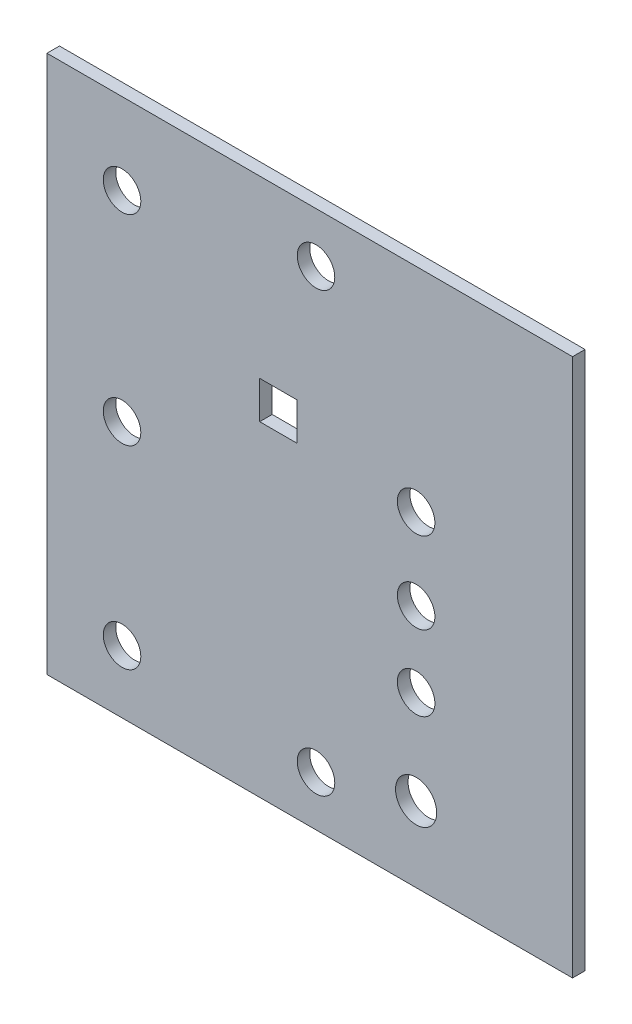
ISO-10303-21;
HEADER;
FILE_DESCRIPTION(('STEP AP214'),'2;1');
FILE_NAME('part.step','',(''),(''),'','','');
FILE_SCHEMA(('AUTOMOTIVE_DESIGN { 1 0 10303 214 1 1 1 1 }'));
ENDSEC;
DATA;
#1=APPLICATION_CONTEXT('core data for automotive mechanical design processes');
#2=APPLICATION_PROTOCOL_DEFINITION('international standard','automotive_design',2000,#1);
#3=PRODUCT_CONTEXT('',#1,'mechanical');
#4=PRODUCT('Part','Part','',(#3));
#5=PRODUCT_RELATED_PRODUCT_CATEGORY('part','',(#4));
#6=PRODUCT_DEFINITION_FORMATION('','',#4);
#7=PRODUCT_DEFINITION_CONTEXT('part definition',#1,'design');
#8=PRODUCT_DEFINITION('design','',#6,#7);
#9=PRODUCT_DEFINITION_SHAPE('','',#8);
#10=(LENGTH_UNIT() NAMED_UNIT(*) SI_UNIT(.MILLI.,.METRE.));
#11=(NAMED_UNIT(*) PLANE_ANGLE_UNIT() SI_UNIT($,.RADIAN.));
#12=(NAMED_UNIT(*) SI_UNIT($,.STERADIAN.) SOLID_ANGLE_UNIT());
#13=UNCERTAINTY_MEASURE_WITH_UNIT(LENGTH_MEASURE(1.E-05),#10,'distance_accuracy_value','');
#14=(GEOMETRIC_REPRESENTATION_CONTEXT(3) GLOBAL_UNCERTAINTY_ASSIGNED_CONTEXT((#13)) GLOBAL_UNIT_ASSIGNED_CONTEXT((#10,
#11,#12)) REPRESENTATION_CONTEXT('',''));
#15=CARTESIAN_POINT('',(0.,0.,0.));
#16=DIRECTION('',(0.,0.,1.));
#17=DIRECTION('',(1.,0.,0.));
#18=AXIS2_PLACEMENT_3D('',#15,#16,#17);
#19=CARTESIAN_POINT('',(0.,-86.,2.));
#20=DIRECTION('',(0.,1.,0.));
#21=DIRECTION('',(0.,0.,1.));
#22=AXIS2_PLACEMENT_3D('',#19,#20,#21);
#23=PLANE('',#22);
#24=DIRECTION('',(1.,0.,0.));
#25=VECTOR('',#24,1.);
#26=CARTESIAN_POINT('',(0.,-86.,0.));
#27=LINE('',#26,#25);
#28=CARTESIAN_POINT('',(1.00000000000001,-86.,0.));
#29=VERTEX_POINT('',#28);
#30=CARTESIAN_POINT('',(85.,-86.,0.));
#31=VERTEX_POINT('',#30);
#32=EDGE_CURVE('E139',#29,#31,#27,.T.);
#33=ORIENTED_EDGE('',*,*,#32,.T.);
#34=DIRECTION('',(0.,0.,1.));
#35=VECTOR('',#34,1.);
#36=CARTESIAN_POINT('',(85.,-86.,-1.));
#37=LINE('',#36,#35);
#38=CARTESIAN_POINT('',(85.,-86.,2.));
#39=VERTEX_POINT('',#38);
#40=EDGE_CURVE('E57',#31,#39,#37,.T.);
#41=ORIENTED_EDGE('',*,*,#40,.T.);
#42=DIRECTION('',(1.,0.,0.));
#43=VECTOR('',#42,1.);
#44=CARTESIAN_POINT('',(0.,-86.,2.));
#45=LINE('',#44,#43);
#46=CARTESIAN_POINT('',(1.00000000000001,-86.,2.));
#47=VERTEX_POINT('',#46);
#48=EDGE_CURVE('E122',#47,#39,#45,.T.);
#49=ORIENTED_EDGE('',*,*,#48,.F.);
#50=DIRECTION('',(0.,0.,1.));
#51=VECTOR('',#50,1.);
#52=CARTESIAN_POINT('',(1.00000000000001,-86.,-1.));
#53=LINE('',#52,#51);
#54=EDGE_CURVE('E206',#29,#47,#53,.T.);
#55=ORIENTED_EDGE('',*,*,#54,.F.);
#56=EDGE_LOOP('',(#33,#41,#49,#55));
#57=FACE_BOUND('',#56,.T.);
#58=ADVANCED_FACE('F42',(#57),#23,.F.);
#59=CARTESIAN_POINT('',(0.,0.,2.));
#60=DIRECTION('',(0.,1.,0.));
#61=DIRECTION('',(0.,0.,1.));
#62=AXIS2_PLACEMENT_3D('',#59,#60,#61);
#63=PLANE('',#62);
#64=DIRECTION('',(0.,0.,1.));
#65=VECTOR('',#64,1.);
#66=CARTESIAN_POINT('',(85.,0.,-1.));
#67=LINE('',#66,#65);
#68=CARTESIAN_POINT('',(85.,0.,0.));
#69=VERTEX_POINT('',#68);
#70=CARTESIAN_POINT('',(85.,0.,2.));
#71=VERTEX_POINT('',#70);
#72=EDGE_CURVE('E104',#69,#71,#67,.T.);
#73=ORIENTED_EDGE('',*,*,#72,.F.);
#74=DIRECTION('',(1.,0.,0.));
#75=VECTOR('',#74,1.);
#76=CARTESIAN_POINT('',(0.,0.,0.));
#77=LINE('',#76,#75);
#78=CARTESIAN_POINT('',(1.00000000000001,0.,0.));
#79=VERTEX_POINT('',#78);
#80=EDGE_CURVE('E135',#79,#69,#77,.T.);
#81=ORIENTED_EDGE('',*,*,#80,.F.);
#82=DIRECTION('',(0.,0.,1.));
#83=VECTOR('',#82,1.);
#84=CARTESIAN_POINT('',(1.,0.,-1.));
#85=LINE('',#84,#83);
#86=CARTESIAN_POINT('',(1.,0.,2.));
#87=VERTEX_POINT('',#86);
#88=EDGE_CURVE('E64',#79,#87,#85,.T.);
#89=ORIENTED_EDGE('',*,*,#88,.T.);
#90=DIRECTION('',(1.,0.,0.));
#91=VECTOR('',#90,1.);
#92=CARTESIAN_POINT('',(0.,0.,2.));
#93=LINE('',#92,#91);
#94=EDGE_CURVE('E120',#87,#71,#93,.T.);
#95=ORIENTED_EDGE('',*,*,#94,.T.);
#96=EDGE_LOOP('',(#73,#81,#89,#95));
#97=FACE_BOUND('',#96,.T.);
#98=ADVANCED_FACE('F126',(#97),#63,.T.);
#99=CARTESIAN_POINT('',(0.,0.,2.));
#100=DIRECTION('',(0.,0.,1.));
#101=DIRECTION('',(1.,0.,0.));
#102=AXIS2_PLACEMENT_3D('',#99,#100,#101);
#103=PLANE('',#102);
#104=DIRECTION('',(0.,-1.,0.));
#105=VECTOR('',#104,1.);
#106=CARTESIAN_POINT('',(85.,0.,2.));
#107=LINE('',#106,#105);
#108=EDGE_CURVE('E107',#71,#39,#107,.T.);
#109=ORIENTED_EDGE('',*,*,#108,.F.);
#110=ORIENTED_EDGE('',*,*,#94,.F.);
#111=DIRECTION('',(0.,1.,0.));
#112=VECTOR('',#111,1.);
#113=CARTESIAN_POINT('',(1.,0.,2.));
#114=LINE('',#113,#112);
#115=EDGE_CURVE('E124',#47,#87,#114,.T.);
#116=ORIENTED_EDGE('',*,*,#115,.F.);
#117=ORIENTED_EDGE('',*,*,#48,.T.);
#118=EDGE_LOOP('',(#109,#110,#116,#117));
#119=FACE_BOUND('',#118,.T.);
#120=DIRECTION('',(0.,-1.,0.));
#121=VECTOR('',#120,1.);
#122=CARTESIAN_POINT('',(35.,-28.,2.));
#123=LINE('',#122,#121);
#124=CARTESIAN_POINT('',(35.,-28.,2.));
#125=VERTEX_POINT('',#124);
#126=CARTESIAN_POINT('',(35.,-34.,2.));
#127=VERTEX_POINT('',#126);
#128=EDGE_CURVE('E216',#125,#127,#123,.T.);
#129=ORIENTED_EDGE('',*,*,#128,.F.);
#130=DIRECTION('',(-1.,0.,0.));
#131=VECTOR('',#130,1.);
#132=CARTESIAN_POINT('',(35.,-28.,2.));
#133=LINE('',#132,#131);
#134=CARTESIAN_POINT('',(41.,-28.,2.));
#135=VERTEX_POINT('',#134);
#136=EDGE_CURVE('E227',#135,#125,#133,.T.);
#137=ORIENTED_EDGE('',*,*,#136,.F.);
#138=DIRECTION('',(0.,1.,0.));
#139=VECTOR('',#138,1.);
#140=CARTESIAN_POINT('',(41.,-28.,2.));
#141=LINE('',#140,#139);
#142=CARTESIAN_POINT('',(41.,-34.,2.));
#143=VERTEX_POINT('',#142);
#144=EDGE_CURVE('E223',#143,#135,#141,.T.);
#145=ORIENTED_EDGE('',*,*,#144,.F.);
#146=DIRECTION('',(1.,0.,0.));
#147=VECTOR('',#146,1.);
#148=CARTESIAN_POINT('',(35.,-34.,2.));
#149=LINE('',#148,#147);
#150=EDGE_CURVE('E219',#127,#143,#149,.T.);
#151=ORIENTED_EDGE('',*,*,#150,.F.);
#152=EDGE_LOOP('',(#129,#137,#145,#151));
#153=FACE_BOUND('',#152,.T.);
#154=CARTESIAN_POINT('',(60.,-74.,2.));
#155=DIRECTION('',(0.,0.,1.));
#156=DIRECTION('',(1.,0.,0.));
#157=AXIS2_PLACEMENT_3D('',#154,#155,#156);
#158=CIRCLE('',#157,3.29079337177774);
#159=CARTESIAN_POINT('',(63.2907933717777,-74.,2.));
#160=VERTEX_POINT('',#159);
#161=EDGE_CURVE('E188',#160,#160,#158,.T.);
#162=ORIENTED_EDGE('',*,*,#161,.F.);
#163=EDGE_LOOP('',(#162));
#164=FACE_BOUND('',#163,.T.);
#165=CARTESIAN_POINT('',(60.,-59.,2.));
#166=DIRECTION('',(0.,0.,1.));
#167=DIRECTION('',(1.,0.,0.));
#168=AXIS2_PLACEMENT_3D('',#165,#166,#167);
#169=CIRCLE('',#168,3.00000000000001);
#170=CARTESIAN_POINT('',(63.,-59.,2.));
#171=VERTEX_POINT('',#170);
#172=EDGE_CURVE('E184',#171,#171,#169,.T.);
#173=ORIENTED_EDGE('',*,*,#172,.F.);
#174=EDGE_LOOP('',(#173));
#175=FACE_BOUND('',#174,.T.);
#176=CARTESIAN_POINT('',(60.,-47.,2.));
#177=DIRECTION('',(0.,0.,1.));
#178=DIRECTION('',(1.,0.,0.));
#179=AXIS2_PLACEMENT_3D('',#176,#177,#178);
#180=CIRCLE('',#179,3.00000000000001);
#181=CARTESIAN_POINT('',(63.,-47.,2.));
#182=VERTEX_POINT('',#181);
#183=EDGE_CURVE('E179',#182,#182,#180,.T.);
#184=ORIENTED_EDGE('',*,*,#183,.F.);
#185=EDGE_LOOP('',(#184));
#186=FACE_BOUND('',#185,.T.);
#187=CARTESIAN_POINT('',(60.,-34.,2.));
#188=DIRECTION('',(0.,0.,1.));
#189=DIRECTION('',(1.,0.,0.));
#190=AXIS2_PLACEMENT_3D('',#187,#188,#189);
#191=CIRCLE('',#190,3.00000000000001);
#192=CARTESIAN_POINT('',(63.,-34.,2.));
#193=VERTEX_POINT('',#192);
#194=EDGE_CURVE('E174',#193,#193,#191,.T.);
#195=ORIENTED_EDGE('',*,*,#194,.F.);
#196=EDGE_LOOP('',(#195));
#197=FACE_BOUND('',#196,.T.);
#198=CARTESIAN_POINT('',(44.,-78.,2.));
#199=DIRECTION('',(0.,0.,1.));
#200=DIRECTION('',(1.,0.,0.));
#201=AXIS2_PLACEMENT_3D('',#198,#199,#200);
#202=CIRCLE('',#201,3.);
#203=CARTESIAN_POINT('',(47.,-78.,2.));
#204=VERTEX_POINT('',#203);
#205=EDGE_CURVE('E169',#204,#204,#202,.T.);
#206=ORIENTED_EDGE('',*,*,#205,.F.);
#207=EDGE_LOOP('',(#206));
#208=FACE_BOUND('',#207,.T.);
#209=CARTESIAN_POINT('',(44.,-8.,2.));
#210=DIRECTION('',(0.,0.,1.));
#211=DIRECTION('',(1.,0.,0.));
#212=AXIS2_PLACEMENT_3D('',#209,#210,#211);
#213=CIRCLE('',#212,3.);
#214=CARTESIAN_POINT('',(47.,-8.,2.));
#215=VERTEX_POINT('',#214);
#216=EDGE_CURVE('E164',#215,#215,#213,.T.);
#217=ORIENTED_EDGE('',*,*,#216,.F.);
#218=EDGE_LOOP('',(#217));
#219=FACE_BOUND('',#218,.T.);
#220=CARTESIAN_POINT('',(13.,-76.,2.));
#221=DIRECTION('',(0.,0.,1.));
#222=DIRECTION('',(1.,0.,0.));
#223=AXIS2_PLACEMENT_3D('',#220,#221,#222);
#224=CIRCLE('',#223,3.);
#225=CARTESIAN_POINT('',(16.,-76.,2.));
#226=VERTEX_POINT('',#225);
#227=EDGE_CURVE('E159',#226,#226,#224,.T.);
#228=ORIENTED_EDGE('',*,*,#227,.F.);
#229=EDGE_LOOP('',(#228));
#230=FACE_BOUND('',#229,.T.);
#231=CARTESIAN_POINT('',(13.,-45.,2.));
#232=DIRECTION('',(0.,0.,1.));
#233=DIRECTION('',(1.,0.,0.));
#234=AXIS2_PLACEMENT_3D('',#231,#232,#233);
#235=CIRCLE('',#234,3.00000000000001);
#236=CARTESIAN_POINT('',(16.,-45.,2.));
#237=VERTEX_POINT('',#236);
#238=EDGE_CURVE('E154',#237,#237,#235,.T.);
#239=ORIENTED_EDGE('',*,*,#238,.F.);
#240=EDGE_LOOP('',(#239));
#241=FACE_BOUND('',#240,.T.);
#242=CARTESIAN_POINT('',(13.,-13.,2.));
#243=DIRECTION('',(0.,0.,1.));
#244=DIRECTION('',(1.,0.,0.));
#245=AXIS2_PLACEMENT_3D('',#242,#243,#244);
#246=CIRCLE('',#245,3.);
#247=CARTESIAN_POINT('',(16.,-13.,2.));
#248=VERTEX_POINT('',#247);
#249=EDGE_CURVE('E149',#248,#248,#246,.T.);
#250=ORIENTED_EDGE('',*,*,#249,.F.);
#251=EDGE_LOOP('',(#250));
#252=FACE_BOUND('',#251,.T.);
#253=ADVANCED_FACE('F117',(#119,#153,#164,#175,#186,#197,#208,#219,#230,#241,#252),#103,.T.);
#254=CARTESIAN_POINT('',(0.,0.,0.));
#255=DIRECTION('',(0.,0.,1.));
#256=DIRECTION('',(1.,0.,0.));
#257=AXIS2_PLACEMENT_3D('',#254,#255,#256);
#258=PLANE('',#257);
#259=DIRECTION('',(-1.,0.,0.));
#260=VECTOR('',#259,1.);
#261=CARTESIAN_POINT('',(0.,-28.,0.));
#262=LINE('',#261,#260);
#263=CARTESIAN_POINT('',(41.,-28.,0.));
#264=VERTEX_POINT('',#263);
#265=CARTESIAN_POINT('',(35.,-28.,0.));
#266=VERTEX_POINT('',#265);
#267=EDGE_CURVE('E193',#264,#266,#262,.T.);
#268=ORIENTED_EDGE('',*,*,#267,.T.);
#269=DIRECTION('',(0.,-1.,0.));
#270=VECTOR('',#269,1.);
#271=CARTESIAN_POINT('',(35.,0.,0.));
#272=LINE('',#271,#270);
#273=CARTESIAN_POINT('',(35.,-34.,0.));
#274=VERTEX_POINT('',#273);
#275=EDGE_CURVE('E197',#266,#274,#272,.T.);
#276=ORIENTED_EDGE('',*,*,#275,.T.);
#277=DIRECTION('',(1.,0.,0.));
#278=VECTOR('',#277,1.);
#279=CARTESIAN_POINT('',(0.,-34.,0.));
#280=LINE('',#279,#278);
#281=CARTESIAN_POINT('',(41.,-34.,0.));
#282=VERTEX_POINT('',#281);
#283=EDGE_CURVE('E128',#274,#282,#280,.T.);
#284=ORIENTED_EDGE('',*,*,#283,.T.);
#285=DIRECTION('',(0.,1.,0.));
#286=VECTOR('',#285,1.);
#287=CARTESIAN_POINT('',(41.,0.,0.));
#288=LINE('',#287,#286);
#289=EDGE_CURVE('E133',#282,#264,#288,.T.);
#290=ORIENTED_EDGE('',*,*,#289,.T.);
#291=EDGE_LOOP('',(#268,#276,#284,#290));
#292=FACE_BOUND('',#291,.T.);
#293=CARTESIAN_POINT('',(60.,-74.,0.));
#294=DIRECTION('',(0.,0.,1.));
#295=DIRECTION('',(1.,0.,0.));
#296=AXIS2_PLACEMENT_3D('',#293,#294,#295);
#297=CIRCLE('',#296,3.29079337177774);
#298=CARTESIAN_POINT('',(63.2907933717777,-74.,0.));
#299=VERTEX_POINT('',#298);
#300=EDGE_CURVE('E185',#299,#299,#297,.T.);
#301=ORIENTED_EDGE('',*,*,#300,.T.);
#302=EDGE_LOOP('',(#301));
#303=FACE_BOUND('',#302,.T.);
#304=CARTESIAN_POINT('',(60.,-59.,0.));
#305=DIRECTION('',(0.,0.,1.));
#306=DIRECTION('',(1.,0.,0.));
#307=AXIS2_PLACEMENT_3D('',#304,#305,#306);
#308=CIRCLE('',#307,3.00000000000001);
#309=CARTESIAN_POINT('',(63.,-59.,0.));
#310=VERTEX_POINT('',#309);
#311=EDGE_CURVE('E180',#310,#310,#308,.T.);
#312=ORIENTED_EDGE('',*,*,#311,.T.);
#313=EDGE_LOOP('',(#312));
#314=FACE_BOUND('',#313,.T.);
#315=CARTESIAN_POINT('',(60.,-47.,0.));
#316=DIRECTION('',(0.,0.,1.));
#317=DIRECTION('',(1.,0.,0.));
#318=AXIS2_PLACEMENT_3D('',#315,#316,#317);
#319=CIRCLE('',#318,3.00000000000001);
#320=CARTESIAN_POINT('',(63.,-47.,0.));
#321=VERTEX_POINT('',#320);
#322=EDGE_CURVE('E175',#321,#321,#319,.T.);
#323=ORIENTED_EDGE('',*,*,#322,.T.);
#324=EDGE_LOOP('',(#323));
#325=FACE_BOUND('',#324,.T.);
#326=CARTESIAN_POINT('',(60.,-34.,0.));
#327=DIRECTION('',(0.,0.,1.));
#328=DIRECTION('',(1.,0.,0.));
#329=AXIS2_PLACEMENT_3D('',#326,#327,#328);
#330=CIRCLE('',#329,3.00000000000001);
#331=CARTESIAN_POINT('',(63.,-34.,0.));
#332=VERTEX_POINT('',#331);
#333=EDGE_CURVE('E170',#332,#332,#330,.T.);
#334=ORIENTED_EDGE('',*,*,#333,.T.);
#335=EDGE_LOOP('',(#334));
#336=FACE_BOUND('',#335,.T.);
#337=CARTESIAN_POINT('',(44.,-78.,0.));
#338=DIRECTION('',(0.,0.,1.));
#339=DIRECTION('',(1.,0.,0.));
#340=AXIS2_PLACEMENT_3D('',#337,#338,#339);
#341=CIRCLE('',#340,3.);
#342=CARTESIAN_POINT('',(47.,-78.,0.));
#343=VERTEX_POINT('',#342);
#344=EDGE_CURVE('E165',#343,#343,#341,.T.);
#345=ORIENTED_EDGE('',*,*,#344,.T.);
#346=EDGE_LOOP('',(#345));
#347=FACE_BOUND('',#346,.T.);
#348=CARTESIAN_POINT('',(44.,-8.,0.));
#349=DIRECTION('',(0.,0.,1.));
#350=DIRECTION('',(1.,0.,0.));
#351=AXIS2_PLACEMENT_3D('',#348,#349,#350);
#352=CIRCLE('',#351,3.);
#353=CARTESIAN_POINT('',(47.,-8.,0.));
#354=VERTEX_POINT('',#353);
#355=EDGE_CURVE('E160',#354,#354,#352,.T.);
#356=ORIENTED_EDGE('',*,*,#355,.T.);
#357=EDGE_LOOP('',(#356));
#358=FACE_BOUND('',#357,.T.);
#359=CARTESIAN_POINT('',(13.,-76.,0.));
#360=DIRECTION('',(0.,0.,1.));
#361=DIRECTION('',(1.,0.,0.));
#362=AXIS2_PLACEMENT_3D('',#359,#360,#361);
#363=CIRCLE('',#362,3.);
#364=CARTESIAN_POINT('',(16.,-76.,0.));
#365=VERTEX_POINT('',#364);
#366=EDGE_CURVE('E155',#365,#365,#363,.T.);
#367=ORIENTED_EDGE('',*,*,#366,.T.);
#368=EDGE_LOOP('',(#367));
#369=FACE_BOUND('',#368,.T.);
#370=CARTESIAN_POINT('',(13.,-45.,0.));
#371=DIRECTION('',(0.,0.,1.));
#372=DIRECTION('',(1.,0.,0.));
#373=AXIS2_PLACEMENT_3D('',#370,#371,#372);
#374=CIRCLE('',#373,3.00000000000001);
#375=CARTESIAN_POINT('',(16.,-45.,0.));
#376=VERTEX_POINT('',#375);
#377=EDGE_CURVE('E150',#376,#376,#374,.T.);
#378=ORIENTED_EDGE('',*,*,#377,.T.);
#379=EDGE_LOOP('',(#378));
#380=FACE_BOUND('',#379,.T.);
#381=CARTESIAN_POINT('',(13.,-13.,0.));
#382=DIRECTION('',(0.,0.,1.));
#383=DIRECTION('',(1.,0.,0.));
#384=AXIS2_PLACEMENT_3D('',#381,#382,#383);
#385=CIRCLE('',#384,3.);
#386=CARTESIAN_POINT('',(16.,-13.,0.));
#387=VERTEX_POINT('',#386);
#388=EDGE_CURVE('E143',#387,#387,#385,.T.);
#389=ORIENTED_EDGE('',*,*,#388,.T.);
#390=EDGE_LOOP('',(#389));
#391=FACE_BOUND('',#390,.T.);
#392=ORIENTED_EDGE('',*,*,#80,.T.);
#393=DIRECTION('',(0.,-1.,0.));
#394=VECTOR('',#393,1.);
#395=CARTESIAN_POINT('',(85.,0.,0.));
#396=LINE('',#395,#394);
#397=EDGE_CURVE('E11',#69,#31,#396,.T.);
#398=ORIENTED_EDGE('',*,*,#397,.T.);
#399=ORIENTED_EDGE('',*,*,#32,.F.);
#400=DIRECTION('',(0.,1.,0.));
#401=VECTOR('',#400,1.);
#402=CARTESIAN_POINT('',(1.,0.,0.));
#403=LINE('',#402,#401);
#404=EDGE_CURVE('E50',#29,#79,#403,.T.);
#405=ORIENTED_EDGE('',*,*,#404,.T.);
#406=EDGE_LOOP('',(#392,#398,#399,#405));
#407=FACE_BOUND('',#406,.T.);
#408=ADVANCED_FACE('F203',(#292,#303,#314,#325,#336,#347,#358,#369,#380,#391,#407),#258,.F.);
#409=CARTESIAN_POINT('',(13.,-13.,-1.));
#410=DIRECTION('',(0.,0.,1.));
#411=DIRECTION('',(1.,0.,0.));
#412=AXIS2_PLACEMENT_3D('',#409,#410,#411);
#413=CYLINDRICAL_SURFACE('',#412,3.);
#414=ORIENTED_EDGE('',*,*,#249,.T.);
#415=EDGE_LOOP('',(#414));
#416=FACE_BOUND('',#415,.T.);
#417=ORIENTED_EDGE('',*,*,#388,.F.);
#418=EDGE_LOOP('',(#417));
#419=FACE_BOUND('',#418,.T.);
#420=ADVANCED_FACE('F271',(#416,#419),#413,.F.);
#421=CARTESIAN_POINT('',(13.,-45.,-1.));
#422=DIRECTION('',(0.,0.,1.));
#423=DIRECTION('',(1.,0.,0.));
#424=AXIS2_PLACEMENT_3D('',#421,#422,#423);
#425=CYLINDRICAL_SURFACE('',#424,3.00000000000001);
#426=ORIENTED_EDGE('',*,*,#238,.T.);
#427=EDGE_LOOP('',(#426));
#428=FACE_BOUND('',#427,.T.);
#429=ORIENTED_EDGE('',*,*,#377,.F.);
#430=EDGE_LOOP('',(#429));
#431=FACE_BOUND('',#430,.T.);
#432=ADVANCED_FACE('F435',(#428,#431),#425,.F.);
#433=CARTESIAN_POINT('',(13.,-76.,-1.));
#434=DIRECTION('',(0.,0.,1.));
#435=DIRECTION('',(1.,0.,0.));
#436=AXIS2_PLACEMENT_3D('',#433,#434,#435);
#437=CYLINDRICAL_SURFACE('',#436,3.);
#438=ORIENTED_EDGE('',*,*,#227,.T.);
#439=EDGE_LOOP('',(#438));
#440=FACE_BOUND('',#439,.T.);
#441=ORIENTED_EDGE('',*,*,#366,.F.);
#442=EDGE_LOOP('',(#441));
#443=FACE_BOUND('',#442,.T.);
#444=ADVANCED_FACE('F425',(#440,#443),#437,.F.);
#445=CARTESIAN_POINT('',(44.,-8.,-1.));
#446=DIRECTION('',(0.,0.,1.));
#447=DIRECTION('',(1.,0.,0.));
#448=AXIS2_PLACEMENT_3D('',#445,#446,#447);
#449=CYLINDRICAL_SURFACE('',#448,3.);
#450=ORIENTED_EDGE('',*,*,#216,.T.);
#451=EDGE_LOOP('',(#450));
#452=FACE_BOUND('',#451,.T.);
#453=ORIENTED_EDGE('',*,*,#355,.F.);
#454=EDGE_LOOP('',(#453));
#455=FACE_BOUND('',#454,.T.);
#456=ADVANCED_FACE('F415',(#452,#455),#449,.F.);
#457=CARTESIAN_POINT('',(44.,-78.,-1.));
#458=DIRECTION('',(0.,0.,1.));
#459=DIRECTION('',(1.,0.,0.));
#460=AXIS2_PLACEMENT_3D('',#457,#458,#459);
#461=CYLINDRICAL_SURFACE('',#460,3.);
#462=ORIENTED_EDGE('',*,*,#205,.T.);
#463=EDGE_LOOP('',(#462));
#464=FACE_BOUND('',#463,.T.);
#465=ORIENTED_EDGE('',*,*,#344,.F.);
#466=EDGE_LOOP('',(#465));
#467=FACE_BOUND('',#466,.T.);
#468=ADVANCED_FACE('F405',(#464,#467),#461,.F.);
#469=CARTESIAN_POINT('',(60.,-34.,-1.));
#470=DIRECTION('',(0.,0.,1.));
#471=DIRECTION('',(1.,0.,0.));
#472=AXIS2_PLACEMENT_3D('',#469,#470,#471);
#473=CYLINDRICAL_SURFACE('',#472,3.00000000000001);
#474=ORIENTED_EDGE('',*,*,#194,.T.);
#475=EDGE_LOOP('',(#474));
#476=FACE_BOUND('',#475,.T.);
#477=ORIENTED_EDGE('',*,*,#333,.F.);
#478=EDGE_LOOP('',(#477));
#479=FACE_BOUND('',#478,.T.);
#480=ADVANCED_FACE('F395',(#476,#479),#473,.F.);
#481=CARTESIAN_POINT('',(60.,-47.,-1.));
#482=DIRECTION('',(0.,0.,1.));
#483=DIRECTION('',(1.,0.,0.));
#484=AXIS2_PLACEMENT_3D('',#481,#482,#483);
#485=CYLINDRICAL_SURFACE('',#484,3.00000000000001);
#486=ORIENTED_EDGE('',*,*,#183,.T.);
#487=EDGE_LOOP('',(#486));
#488=FACE_BOUND('',#487,.T.);
#489=ORIENTED_EDGE('',*,*,#322,.F.);
#490=EDGE_LOOP('',(#489));
#491=FACE_BOUND('',#490,.T.);
#492=ADVANCED_FACE('F385',(#488,#491),#485,.F.);
#493=CARTESIAN_POINT('',(60.,-59.,-1.));
#494=DIRECTION('',(0.,0.,1.));
#495=DIRECTION('',(1.,0.,0.));
#496=AXIS2_PLACEMENT_3D('',#493,#494,#495);
#497=CYLINDRICAL_SURFACE('',#496,3.00000000000001);
#498=ORIENTED_EDGE('',*,*,#172,.T.);
#499=EDGE_LOOP('',(#498));
#500=FACE_BOUND('',#499,.T.);
#501=ORIENTED_EDGE('',*,*,#311,.F.);
#502=EDGE_LOOP('',(#501));
#503=FACE_BOUND('',#502,.T.);
#504=ADVANCED_FACE('F375',(#500,#503),#497,.F.);
#505=CARTESIAN_POINT('',(60.,-74.,-1.));
#506=DIRECTION('',(0.,0.,1.));
#507=DIRECTION('',(1.,0.,0.));
#508=AXIS2_PLACEMENT_3D('',#505,#506,#507);
#509=CYLINDRICAL_SURFACE('',#508,3.29079337177774);
#510=ORIENTED_EDGE('',*,*,#161,.T.);
#511=EDGE_LOOP('',(#510));
#512=FACE_BOUND('',#511,.T.);
#513=ORIENTED_EDGE('',*,*,#300,.F.);
#514=EDGE_LOOP('',(#513));
#515=FACE_BOUND('',#514,.T.);
#516=ADVANCED_FACE('F365',(#512,#515),#509,.F.);
#517=CARTESIAN_POINT('',(35.,-28.,-1.));
#518=DIRECTION('',(-1.,0.,0.));
#519=DIRECTION('',(0.,0.,1.));
#520=AXIS2_PLACEMENT_3D('',#517,#518,#519);
#521=PLANE('',#520);
#522=DIRECTION('',(0.,0.,1.));
#523=VECTOR('',#522,1.);
#524=CARTESIAN_POINT('',(35.,-28.,-1.));
#525=LINE('',#524,#523);
#526=EDGE_CURVE('E232',#266,#125,#525,.T.);
#527=ORIENTED_EDGE('',*,*,#526,.T.);
#528=ORIENTED_EDGE('',*,*,#128,.T.);
#529=DIRECTION('',(0.,0.,1.));
#530=VECTOR('',#529,1.);
#531=CARTESIAN_POINT('',(35.,-34.,-1.));
#532=LINE('',#531,#530);
#533=EDGE_CURVE('E231',#274,#127,#532,.T.);
#534=ORIENTED_EDGE('',*,*,#533,.F.);
#535=ORIENTED_EDGE('',*,*,#275,.F.);
#536=EDGE_LOOP('',(#527,#528,#534,#535));
#537=FACE_BOUND('',#536,.T.);
#538=ADVANCED_FACE('F355',(#537),#521,.F.);
#539=CARTESIAN_POINT('',(35.,-28.,-1.));
#540=DIRECTION('',(0.,1.,0.));
#541=DIRECTION('',(-1.,0.,0.));
#542=AXIS2_PLACEMENT_3D('',#539,#540,#541);
#543=PLANE('',#542);
#544=DIRECTION('',(0.,0.,1.));
#545=VECTOR('',#544,1.);
#546=CARTESIAN_POINT('',(41.,-28.,-1.));
#547=LINE('',#546,#545);
#548=EDGE_CURVE('E235',#264,#135,#547,.T.);
#549=ORIENTED_EDGE('',*,*,#548,.T.);
#550=ORIENTED_EDGE('',*,*,#136,.T.);
#551=ORIENTED_EDGE('',*,*,#526,.F.);
#552=ORIENTED_EDGE('',*,*,#267,.F.);
#553=EDGE_LOOP('',(#549,#550,#551,#552));
#554=FACE_BOUND('',#553,.T.);
#555=ADVANCED_FACE('F345',(#554),#543,.F.);
#556=CARTESIAN_POINT('',(41.,-28.,-1.));
#557=DIRECTION('',(1.,0.,0.));
#558=DIRECTION('',(0.,0.,-1.));
#559=AXIS2_PLACEMENT_3D('',#556,#557,#558);
#560=PLANE('',#559);
#561=DIRECTION('',(0.,0.,1.));
#562=VECTOR('',#561,1.);
#563=CARTESIAN_POINT('',(41.,-34.,-1.));
#564=LINE('',#563,#562);
#565=EDGE_CURVE('E238',#282,#143,#564,.T.);
#566=ORIENTED_EDGE('',*,*,#565,.T.);
#567=ORIENTED_EDGE('',*,*,#144,.T.);
#568=ORIENTED_EDGE('',*,*,#548,.F.);
#569=ORIENTED_EDGE('',*,*,#289,.F.);
#570=EDGE_LOOP('',(#566,#567,#568,#569));
#571=FACE_BOUND('',#570,.T.);
#572=ADVANCED_FACE('F336',(#571),#560,.F.);
#573=CARTESIAN_POINT('',(35.,-34.,-1.));
#574=DIRECTION('',(0.,-1.,0.));
#575=DIRECTION('',(1.,0.,0.));
#576=AXIS2_PLACEMENT_3D('',#573,#574,#575);
#577=PLANE('',#576);
#578=ORIENTED_EDGE('',*,*,#533,.T.);
#579=ORIENTED_EDGE('',*,*,#150,.T.);
#580=ORIENTED_EDGE('',*,*,#565,.F.);
#581=ORIENTED_EDGE('',*,*,#283,.F.);
#582=EDGE_LOOP('',(#578,#579,#580,#581));
#583=FACE_BOUND('',#582,.T.);
#584=ADVANCED_FACE('F315',(#583),#577,.F.);
#585=CARTESIAN_POINT('',(1.,0.,-1.));
#586=DIRECTION('',(1.,0.,0.));
#587=DIRECTION('',(0.,1.,0.));
#588=AXIS2_PLACEMENT_3D('',#585,#586,#587);
#589=PLANE('',#588);
#590=ORIENTED_EDGE('',*,*,#54,.T.);
#591=ORIENTED_EDGE('',*,*,#115,.T.);
#592=ORIENTED_EDGE('',*,*,#88,.F.);
#593=ORIENTED_EDGE('',*,*,#404,.F.);
#594=EDGE_LOOP('',(#590,#591,#592,#593));
#595=FACE_BOUND('',#594,.T.);
#596=ADVANCED_FACE('F205',(#595),#589,.F.);
#597=CARTESIAN_POINT('',(85.,0.,-1.));
#598=DIRECTION('',(-1.,0.,0.));
#599=DIRECTION('',(0.,-1.,0.));
#600=AXIS2_PLACEMENT_3D('',#597,#598,#599);
#601=PLANE('',#600);
#602=ORIENTED_EDGE('',*,*,#72,.T.);
#603=ORIENTED_EDGE('',*,*,#108,.T.);
#604=ORIENTED_EDGE('',*,*,#40,.F.);
#605=ORIENTED_EDGE('',*,*,#397,.F.);
#606=EDGE_LOOP('',(#602,#603,#604,#605));
#607=FACE_BOUND('',#606,.T.);
#608=ADVANCED_FACE('F106',(#607),#601,.F.);
#609=CLOSED_SHELL('',(#58,#98,#253,#408,#420,#432,#444,#456,#468,#480,#492,#504,#516,#538,#555,
#572,#584,#596,#608));
#610=MANIFOLD_SOLID_BREP('B2',#609);
#611=ADVANCED_BREP_SHAPE_REPRESENTATION('',(#18,#610),#14);
#612=SHAPE_DEFINITION_REPRESENTATION(#9,#611);
ENDSEC;
END-ISO-10303-21;
